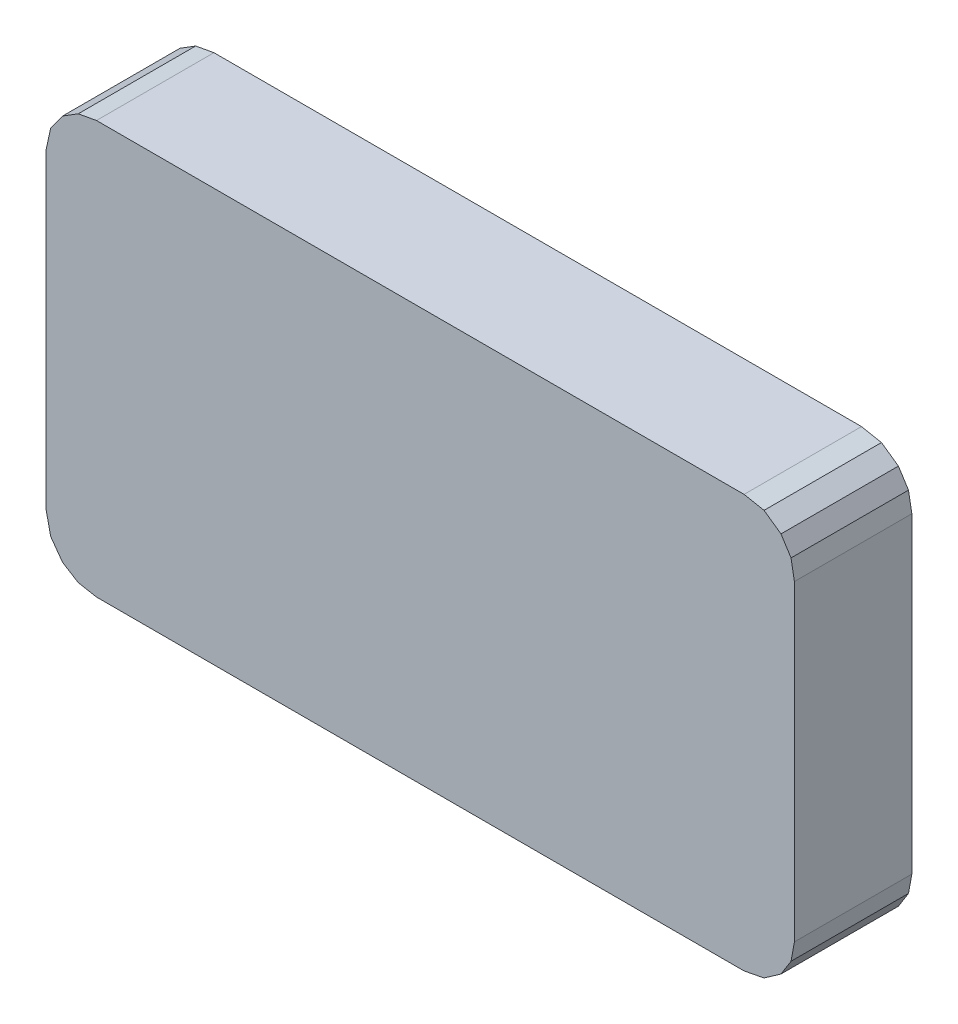
ISO-10303-21;
HEADER;
FILE_DESCRIPTION(('STEP AP214'),'2;1');
FILE_NAME('part.step','',(''),(''),'','','');
FILE_SCHEMA(('AUTOMOTIVE_DESIGN { 1 0 10303 214 1 1 1 1 }'));
ENDSEC;
DATA;
#1=APPLICATION_CONTEXT('core data for automotive mechanical design processes');
#2=APPLICATION_PROTOCOL_DEFINITION('international standard','automotive_design',2000,#1);
#3=PRODUCT_CONTEXT('',#1,'mechanical');
#4=PRODUCT('Part','Part','',(#3));
#5=PRODUCT_RELATED_PRODUCT_CATEGORY('part','',(#4));
#6=PRODUCT_DEFINITION_FORMATION('','',#4);
#7=PRODUCT_DEFINITION_CONTEXT('part definition',#1,'design');
#8=PRODUCT_DEFINITION('design','',#6,#7);
#9=PRODUCT_DEFINITION_SHAPE('','',#8);
#10=(LENGTH_UNIT() NAMED_UNIT(*) SI_UNIT(.MILLI.,.METRE.));
#11=(NAMED_UNIT(*) PLANE_ANGLE_UNIT() SI_UNIT($,.RADIAN.));
#12=(NAMED_UNIT(*) SI_UNIT($,.STERADIAN.) SOLID_ANGLE_UNIT());
#13=UNCERTAINTY_MEASURE_WITH_UNIT(LENGTH_MEASURE(1.E-05),#10,'distance_accuracy_value','');
#14=(GEOMETRIC_REPRESENTATION_CONTEXT(3) GLOBAL_UNCERTAINTY_ASSIGNED_CONTEXT((#13)) GLOBAL_UNIT_ASSIGNED_CONTEXT((#10,
#11,#12)) REPRESENTATION_CONTEXT('',''));
#15=CARTESIAN_POINT('',(0.,0.,0.));
#16=DIRECTION('',(0.,0.,1.));
#17=DIRECTION('',(1.,0.,0.));
#18=AXIS2_PLACEMENT_3D('',#15,#16,#17);
#19=CARTESIAN_POINT('',(12.500505360678,7.00002739885,1.000000526072));
#20=DIRECTION('',(0.,0.,-1.));
#21=DIRECTION('',(-1.,0.,0.));
#22=AXIS2_PLACEMENT_3D('',#19,#20,#21);
#23=PLANE('',#22);
#24=DIRECTION('',(0.538033386964818,-0.842923528270012,0.));
#25=VECTOR('',#24,1.);
#26=CARTESIAN_POINT('',(14.64999758,8.135999071816,1.000000526072));
#27=LINE('',#26,#25);
#28=CARTESIAN_POINT('',(14.64999758,8.135999071816,1.000000526072));
#29=VERTEX_POINT('',#28);
#30=CARTESIAN_POINT('',(14.70999746,8.041998751816,1.000000526072));
#31=VERTEX_POINT('',#30);
#32=EDGE_CURVE('E172',#29,#31,#27,.T.);
#33=ORIENTED_EDGE('',*,*,#32,.F.);
#34=DIRECTION('',(0.818081035233929,-0.57510296451208,0.));
#35=VECTOR('',#34,1.);
#36=CARTESIAN_POINT('',(14.54899956,8.206999691816,1.000000526072));
#37=LINE('',#36,#35);
#38=CARTESIAN_POINT('',(14.54899956,8.20699969181601,1.000000526072));
#39=VERTEX_POINT('',#38);
#40=EDGE_CURVE('E151',#39,#29,#37,.T.);
#41=ORIENTED_EDGE('',*,*,#40,.F.);
#42=DIRECTION('',(0.981857978872436,-0.189617798016262,0.));
#43=VECTOR('',#42,1.);
#44=CARTESIAN_POINT('',(14.43002342,8.229976531816,1.000000526072));
#45=LINE('',#44,#43);
#46=CARTESIAN_POINT('',(14.43002342,8.229976531816,1.000000526072));
#47=VERTEX_POINT('',#46);
#48=EDGE_CURVE('E20',#47,#39,#45,.T.);
#49=ORIENTED_EDGE('',*,*,#48,.F.);
#50=DIRECTION('',(1.,0.,0.));
#51=VECTOR('',#50,1.);
#52=CARTESIAN_POINT('',(10.57002098,8.229976531816,1.000000526072));
#53=LINE('',#52,#51);
#54=CARTESIAN_POINT('',(10.57002098,8.22997653181601,1.000000526072));
#55=VERTEX_POINT('',#54);
#56=EDGE_CURVE('E252',#55,#47,#53,.T.);
#57=ORIENTED_EDGE('',*,*,#56,.F.);
#58=DIRECTION('',(-0.983622947770769,-0.180238443786958,0.));
#59=VECTOR('',#58,1.);
#60=CARTESIAN_POINT('',(10.4609991,8.209999431816,1.000000526072));
#61=LINE('',#60,#59);
#62=CARTESIAN_POINT('',(10.4609991,8.20999943181599,1.000000526072));
#63=VERTEX_POINT('',#62);
#64=EDGE_CURVE('E247',#63,#55,#61,.F.);
#65=ORIENTED_EDGE('',*,*,#64,.F.);
#66=DIRECTION('',(-0.848505667475352,-0.52918629258722,0.));
#67=VECTOR('',#66,1.);
#68=CARTESIAN_POINT('',(10.36799954,8.151998531816,1.000000526072));
#69=LINE('',#68,#67);
#70=CARTESIAN_POINT('',(10.36799954,8.15199853181601,1.000000526072));
#71=VERTEX_POINT('',#70);
#72=EDGE_CURVE('E242',#71,#63,#69,.F.);
#73=ORIENTED_EDGE('',*,*,#72,.F.);
#74=DIRECTION('',(-0.59064525537376,-0.806931336796673,0.));
#75=VECTOR('',#74,1.);
#76=CARTESIAN_POINT('',(10.29699892,8.054998471816,1.000000526072));
#77=LINE('',#76,#75);
#78=CARTESIAN_POINT('',(10.29699892,8.054998471816,1.000000526072));
#79=VERTEX_POINT('',#78);
#80=EDGE_CURVE('E237',#79,#71,#77,.F.);
#81=ORIENTED_EDGE('',*,*,#80,.F.);
#82=DIRECTION('',(-0.211134831832987,-0.977456946768939,0.));
#83=VECTOR('',#82,1.);
#84=CARTESIAN_POINT('',(10.26999872,7.929999991816,1.000000526072));
#85=LINE('',#84,#83);
#86=CARTESIAN_POINT('',(10.26999872,7.929999991816,1.000000526072));
#87=VERTEX_POINT('',#86);
#88=EDGE_CURVE('E232',#87,#79,#85,.F.);
#89=ORIENTED_EDGE('',*,*,#88,.F.);
#90=DIRECTION('',(0.,1.,0.));
#91=VECTOR('',#90,1.);
#92=CARTESIAN_POINT('',(10.26999872,6.069998631816,1.000000526072));
#93=LINE('',#92,#91);
#94=CARTESIAN_POINT('',(10.26999872,6.069998631816,1.000000526072));
#95=VERTEX_POINT('',#94);
#96=EDGE_CURVE('E227',#95,#87,#93,.T.);
#97=ORIENTED_EDGE('',*,*,#96,.F.);
#98=DIRECTION('',(0.212757854209079,-0.977104956221361,0.));
#99=VECTOR('',#98,1.);
#100=CARTESIAN_POINT('',(10.29699892,5.945998371816,1.000000526072));
#101=LINE('',#100,#99);
#102=CARTESIAN_POINT('',(10.29699892,5.94599837181598,1.000000526072));
#103=VERTEX_POINT('',#102);
#104=EDGE_CURVE('E222',#103,#95,#101,.F.);
#105=ORIENTED_EDGE('',*,*,#104,.F.);
#106=DIRECTION('',(0.586706833159886,-0.809799414622842,0.));
#107=VECTOR('',#106,1.);
#108=CARTESIAN_POINT('',(10.36799954,5.848000091816,1.000000526072));
#109=LINE('',#108,#107);
#110=CARTESIAN_POINT('',(10.36799954,5.84800009181599,1.000000526072));
#111=VERTEX_POINT('',#110);
#112=EDGE_CURVE('E217',#111,#103,#109,.F.);
#113=ORIENTED_EDGE('',*,*,#112,.F.);
#114=DIRECTION('',(0.848505667475352,-0.52918629258722,0.));
#115=VECTOR('',#114,1.);
#116=CARTESIAN_POINT('',(10.4609991,5.789999191816,1.000000526072));
#117=LINE('',#116,#115);
#118=CARTESIAN_POINT('',(10.4609991,5.78999919181601,1.000000526072));
#119=VERTEX_POINT('',#118);
#120=EDGE_CURVE('E212',#119,#111,#117,.F.);
#121=ORIENTED_EDGE('',*,*,#120,.F.);
#122=DIRECTION('',(0.983549741971551,-0.180637496294917,0.));
#123=VECTOR('',#122,1.);
#124=CARTESIAN_POINT('',(10.57002098,5.769976371816,1.000000526072));
#125=LINE('',#124,#123);
#126=CARTESIAN_POINT('',(10.57002098,5.76997637181599,1.000000526072));
#127=VERTEX_POINT('',#126);
#128=EDGE_CURVE('E207',#127,#119,#125,.F.);
#129=ORIENTED_EDGE('',*,*,#128,.F.);
#130=DIRECTION('',(0.999999999982463,5.92227605307774E-06,0.));
#131=VECTOR('',#130,1.);
#132=CARTESIAN_POINT('',(14.43002342,5.769999231816,1.000000526072));
#133=LINE('',#132,#131);
#134=CARTESIAN_POINT('',(14.43002342,5.76999923181603,1.000000526072));
#135=VERTEX_POINT('',#134);
#136=EDGE_CURVE('E202',#135,#127,#133,.F.);
#137=ORIENTED_EDGE('',*,*,#136,.F.);
#138=DIRECTION('',(0.98182284019013,0.189799658801025,0.));
#139=VECTOR('',#138,1.);
#140=CARTESIAN_POINT('',(14.54899956,5.792998931816,1.000000526072));
#141=LINE('',#140,#139);
#142=CARTESIAN_POINT('',(14.54899956,5.79299893181601,1.000000526072));
#143=VERTEX_POINT('',#142);
#144=EDGE_CURVE('E197',#143,#135,#141,.F.);
#145=ORIENTED_EDGE('',*,*,#144,.F.);
#146=DIRECTION('',(0.81808103523399,0.575102964511993,0.));
#147=VECTOR('',#146,1.);
#148=CARTESIAN_POINT('',(14.64999758,5.863999551816,1.000000526072));
#149=LINE('',#148,#147);
#150=CARTESIAN_POINT('',(14.64999758,5.86399955181602,1.000000526072));
#151=VERTEX_POINT('',#150);
#152=EDGE_CURVE('E192',#151,#143,#149,.F.);
#153=ORIENTED_EDGE('',*,*,#152,.F.);
#154=DIRECTION('',(0.530000956788827,0.847997043510723,0.));
#155=VECTOR('',#154,1.);
#156=CARTESIAN_POINT('',(14.70999746,5.959998851816,1.000000526072));
#157=LINE('',#156,#155);
#158=CARTESIAN_POINT('',(14.70999746,5.959998851816,1.000000526072));
#159=VERTEX_POINT('',#158);
#160=EDGE_CURVE('E187',#159,#151,#157,.F.);
#161=ORIENTED_EDGE('',*,*,#160,.F.);
#162=DIRECTION('',(0.178907429570017,0.983865911415092,0.));
#163=VECTOR('',#162,1.);
#164=CARTESIAN_POINT('',(14.72999996,6.069998631816,1.000000526072));
#165=LINE('',#164,#163);
#166=CARTESIAN_POINT('',(14.72999996,6.069998631816,1.000000526072));
#167=VERTEX_POINT('',#166);
#168=EDGE_CURVE('E182',#167,#159,#165,.F.);
#169=ORIENTED_EDGE('',*,*,#168,.F.);
#170=DIRECTION('',(0.,1.,0.));
#171=VECTOR('',#170,1.);
#172=CARTESIAN_POINT('',(14.72999996,7.929999991816,1.000000526072));
#173=LINE('',#172,#171);
#174=CARTESIAN_POINT('',(14.72999996,7.92999999181601,1.000000526072));
#175=VERTEX_POINT('',#174);
#176=EDGE_CURVE('E177',#175,#167,#173,.F.);
#177=ORIENTED_EDGE('',*,*,#176,.F.);
#178=DIRECTION('',(0.175813819490637,-0.984423435761316,0.));
#179=VECTOR('',#178,1.);
#180=CARTESIAN_POINT('',(14.70999746,8.041998751816,1.000000526072));
#181=LINE('',#180,#179);
#182=EDGE_CURVE('E173',#31,#175,#181,.T.);
#183=ORIENTED_EDGE('',*,*,#182,.F.);
#184=EDGE_LOOP('',(#33,#41,#49,#57,#65,#73,#81,#89,#97,#105,#113,#121,#129,#137,#145,#153,#161,
#169,#177,#183));
#185=FACE_BOUND('',#184,.T.);
#186=ADVANCED_FACE('F17',(#185),#23,.F.);
#187=CARTESIAN_POINT('',(14.72999996,7.929999991816,0.299999386072));
#188=DIRECTION('',(1.,0.,0.));
#189=DIRECTION('',(0.,0.,-1.));
#190=AXIS2_PLACEMENT_3D('',#187,#188,#189);
#191=PLANE('',#190);
#192=DIRECTION('',(0.,0.,1.));
#193=VECTOR('',#192,1.);
#194=CARTESIAN_POINT('',(14.72999996,6.069998631816,0.299999386072));
#195=LINE('',#194,#193);
#196=CARTESIAN_POINT('',(14.72999996,6.069998631816,0.299999386072));
#197=VERTEX_POINT('',#196);
#198=EDGE_CURVE('E179',#197,#167,#195,.T.);
#199=ORIENTED_EDGE('',*,*,#198,.F.);
#200=DIRECTION('',(0.,1.,0.));
#201=VECTOR('',#200,1.);
#202=CARTESIAN_POINT('',(14.72999996,7.00002739885,0.299999386072));
#203=LINE('',#202,#201);
#204=CARTESIAN_POINT('',(14.72999996,7.929999991816,0.299999386072));
#205=VERTEX_POINT('',#204);
#206=EDGE_CURVE('E260',#205,#197,#203,.F.);
#207=ORIENTED_EDGE('',*,*,#206,.F.);
#208=DIRECTION('',(0.,0.,1.));
#209=VECTOR('',#208,1.);
#210=CARTESIAN_POINT('',(14.72999996,7.92999999181601,0.299999386072));
#211=LINE('',#210,#209);
#212=EDGE_CURVE('E257',#175,#205,#211,.F.);
#213=ORIENTED_EDGE('',*,*,#212,.F.);
#214=ORIENTED_EDGE('',*,*,#176,.T.);
#215=EDGE_LOOP('',(#199,#207,#213,#214));
#216=FACE_BOUND('',#215,.T.);
#217=ADVANCED_FACE('F322',(#216),#191,.T.);
#218=CARTESIAN_POINT('',(14.72999996,6.069998631816,0.299999386072));
#219=DIRECTION('',(0.983865911415092,-0.178907429570017,0.));
#220=DIRECTION('',(0.178907429570017,0.983865911415092,0.));
#221=AXIS2_PLACEMENT_3D('',#218,#219,#220);
#222=PLANE('',#221);
#223=DIRECTION('',(0.,0.,1.));
#224=VECTOR('',#223,1.);
#225=CARTESIAN_POINT('',(14.70999746,5.959998851816,0.299999386072));
#226=LINE('',#225,#224);
#227=CARTESIAN_POINT('',(14.70999746,5.959998851816,0.299999386072));
#228=VERTEX_POINT('',#227);
#229=EDGE_CURVE('E184',#228,#159,#226,.T.);
#230=ORIENTED_EDGE('',*,*,#229,.F.);
#231=DIRECTION('',(-0.178907429570127,-0.983865911415072,0.));
#232=VECTOR('',#231,1.);
#233=CARTESIAN_POINT('',(14.72999996,6.069998631816,0.299999386072));
#234=LINE('',#233,#232);
#235=EDGE_CURVE('E263',#197,#228,#234,.T.);
#236=ORIENTED_EDGE('',*,*,#235,.F.);
#237=ORIENTED_EDGE('',*,*,#198,.T.);
#238=ORIENTED_EDGE('',*,*,#168,.T.);
#239=EDGE_LOOP('',(#230,#236,#237,#238));
#240=FACE_BOUND('',#239,.T.);
#241=ADVANCED_FACE('F326',(#240),#222,.T.);
#242=CARTESIAN_POINT('',(14.70999746,5.959998851816,0.299999386072));
#243=DIRECTION('',(0.847997043510723,-0.530000956788827,0.));
#244=DIRECTION('',(0.530000956788827,0.847997043510723,0.));
#245=AXIS2_PLACEMENT_3D('',#242,#243,#244);
#246=PLANE('',#245);
#247=DIRECTION('',(0.,0.,1.));
#248=VECTOR('',#247,1.);
#249=CARTESIAN_POINT('',(14.64999758,5.863999551816,0.299999386072));
#250=LINE('',#249,#248);
#251=CARTESIAN_POINT('',(14.64999758,5.86399955181602,0.299999386072));
#252=VERTEX_POINT('',#251);
#253=EDGE_CURVE('E189',#252,#151,#250,.T.);
#254=ORIENTED_EDGE('',*,*,#253,.F.);
#255=DIRECTION('',(-0.530000956788381,-0.847997043511003,0.));
#256=VECTOR('',#255,1.);
#257=CARTESIAN_POINT('',(14.70999746,5.959998851816,0.299999386072));
#258=LINE('',#257,#256);
#259=EDGE_CURVE('E266',#228,#252,#258,.T.);
#260=ORIENTED_EDGE('',*,*,#259,.F.);
#261=ORIENTED_EDGE('',*,*,#229,.T.);
#262=ORIENTED_EDGE('',*,*,#160,.T.);
#263=EDGE_LOOP('',(#254,#260,#261,#262));
#264=FACE_BOUND('',#263,.T.);
#265=ADVANCED_FACE('F328',(#264),#246,.T.);
#266=CARTESIAN_POINT('',(14.64999758,5.863999551816,0.299999386072));
#267=DIRECTION('',(0.575102964511993,-0.81808103523399,0.));
#268=DIRECTION('',(0.81808103523399,0.575102964511993,0.));
#269=AXIS2_PLACEMENT_3D('',#266,#267,#268);
#270=PLANE('',#269);
#271=DIRECTION('',(0.,0.,1.));
#272=VECTOR('',#271,1.);
#273=CARTESIAN_POINT('',(14.54899956,5.792998931816,0.299999386072));
#274=LINE('',#273,#272);
#275=CARTESIAN_POINT('',(14.54899956,5.79299893181601,0.299999386072));
#276=VERTEX_POINT('',#275);
#277=EDGE_CURVE('E194',#276,#143,#274,.T.);
#278=ORIENTED_EDGE('',*,*,#277,.F.);
#279=DIRECTION('',(-0.818081035233926,-0.575102964512085,0.));
#280=VECTOR('',#279,1.);
#281=CARTESIAN_POINT('',(14.64999758,5.863999551816,0.299999386072));
#282=LINE('',#281,#280);
#283=EDGE_CURVE('E269',#252,#276,#282,.T.);
#284=ORIENTED_EDGE('',*,*,#283,.F.);
#285=ORIENTED_EDGE('',*,*,#253,.T.);
#286=ORIENTED_EDGE('',*,*,#152,.T.);
#287=EDGE_LOOP('',(#278,#284,#285,#286));
#288=FACE_BOUND('',#287,.T.);
#289=ADVANCED_FACE('F332',(#288),#270,.T.);
#290=CARTESIAN_POINT('',(14.54899956,5.792998931816,0.299999386072));
#291=DIRECTION('',(0.189799658801025,-0.98182284019013,0.));
#292=DIRECTION('',(0.98182284019013,0.189799658801025,0.));
#293=AXIS2_PLACEMENT_3D('',#290,#291,#292);
#294=PLANE('',#293);
#295=DIRECTION('',(0.,0.,1.));
#296=VECTOR('',#295,1.);
#297=CARTESIAN_POINT('',(14.43002342,5.769999231816,0.299999386072));
#298=LINE('',#297,#296);
#299=CARTESIAN_POINT('',(14.43002342,5.76999923181603,0.299999386072));
#300=VERTEX_POINT('',#299);
#301=EDGE_CURVE('E199',#300,#135,#298,.T.);
#302=ORIENTED_EDGE('',*,*,#301,.F.);
#303=DIRECTION('',(-0.98182284019004,-0.189799658801492,0.));
#304=VECTOR('',#303,1.);
#305=CARTESIAN_POINT('',(14.54899956,5.792998931816,0.299999386072));
#306=LINE('',#305,#304);
#307=EDGE_CURVE('E272',#276,#300,#306,.T.);
#308=ORIENTED_EDGE('',*,*,#307,.F.);
#309=ORIENTED_EDGE('',*,*,#277,.T.);
#310=ORIENTED_EDGE('',*,*,#144,.T.);
#311=EDGE_LOOP('',(#302,#308,#309,#310));
#312=FACE_BOUND('',#311,.T.);
#313=ADVANCED_FACE('F336',(#312),#294,.T.);
#314=CARTESIAN_POINT('',(14.43002342,5.769999231816,0.299999386072));
#315=DIRECTION('',(5.92227605307774E-06,-0.999999999982463,0.));
#316=DIRECTION('',(0.999999999982463,5.92227605307774E-06,0.));
#317=AXIS2_PLACEMENT_3D('',#314,#315,#316);
#318=PLANE('',#317);
#319=DIRECTION('',(0.,0.,1.));
#320=VECTOR('',#319,1.);
#321=CARTESIAN_POINT('',(10.57002098,5.769976371816,0.299999386072));
#322=LINE('',#321,#320);
#323=CARTESIAN_POINT('',(10.57002098,5.76997637181599,0.299999386072));
#324=VERTEX_POINT('',#323);
#325=EDGE_CURVE('E204',#324,#127,#322,.T.);
#326=ORIENTED_EDGE('',*,*,#325,.F.);
#327=DIRECTION('',(-0.999999999982463,-5.92227604895712E-06,0.));
#328=VECTOR('',#327,1.);
#329=CARTESIAN_POINT('',(14.43002342,5.769999231816,0.299999386072));
#330=LINE('',#329,#328);
#331=EDGE_CURVE('E275',#300,#324,#330,.T.);
#332=ORIENTED_EDGE('',*,*,#331,.F.);
#333=ORIENTED_EDGE('',*,*,#301,.T.);
#334=ORIENTED_EDGE('',*,*,#136,.T.);
#335=EDGE_LOOP('',(#326,#332,#333,#334));
#336=FACE_BOUND('',#335,.T.);
#337=ADVANCED_FACE('F340',(#336),#318,.T.);
#338=CARTESIAN_POINT('',(10.57002098,5.769976371816,0.299999386072));
#339=DIRECTION('',(-0.180637496294917,-0.983549741971551,0.));
#340=DIRECTION('',(0.983549741971551,-0.180637496294917,0.));
#341=AXIS2_PLACEMENT_3D('',#338,#339,#340);
#342=PLANE('',#341);
#343=DIRECTION('',(0.,0.,1.));
#344=VECTOR('',#343,1.);
#345=CARTESIAN_POINT('',(10.4609991,5.789999191816,0.299999386072));
#346=LINE('',#345,#344);
#347=CARTESIAN_POINT('',(10.4609991,5.78999919181601,0.299999386072));
#348=VERTEX_POINT('',#347);
#349=EDGE_CURVE('E209',#348,#119,#346,.T.);
#350=ORIENTED_EDGE('',*,*,#349,.F.);
#351=DIRECTION('',(-0.983549741971587,0.180637496294719,0.));
#352=VECTOR('',#351,1.);
#353=CARTESIAN_POINT('',(10.57002098,5.769976371816,0.299999386072));
#354=LINE('',#353,#352);
#355=EDGE_CURVE('E278',#324,#348,#354,.T.);
#356=ORIENTED_EDGE('',*,*,#355,.F.);
#357=ORIENTED_EDGE('',*,*,#325,.T.);
#358=ORIENTED_EDGE('',*,*,#128,.T.);
#359=EDGE_LOOP('',(#350,#356,#357,#358));
#360=FACE_BOUND('',#359,.T.);
#361=ADVANCED_FACE('F344',(#360),#342,.T.);
#362=CARTESIAN_POINT('',(10.4609991,5.789999191816,0.299999386072));
#363=DIRECTION('',(-0.52918629258722,-0.848505667475352,0.));
#364=DIRECTION('',(0.848505667475352,-0.52918629258722,0.));
#365=AXIS2_PLACEMENT_3D('',#362,#363,#364);
#366=PLANE('',#365);
#367=DIRECTION('',(0.,0.,1.));
#368=VECTOR('',#367,1.);
#369=CARTESIAN_POINT('',(10.36799954,5.848000091816,0.299999386072));
#370=LINE('',#369,#368);
#371=CARTESIAN_POINT('',(10.36799954,5.84800009181599,0.299999386072));
#372=VERTEX_POINT('',#371);
#373=EDGE_CURVE('E214',#372,#111,#370,.T.);
#374=ORIENTED_EDGE('',*,*,#373,.F.);
#375=DIRECTION('',(-0.848505667475214,0.529186292587441,0.));
#376=VECTOR('',#375,1.);
#377=CARTESIAN_POINT('',(10.4609991,5.789999191816,0.299999386072));
#378=LINE('',#377,#376);
#379=EDGE_CURVE('E281',#348,#372,#378,.T.);
#380=ORIENTED_EDGE('',*,*,#379,.F.);
#381=ORIENTED_EDGE('',*,*,#349,.T.);
#382=ORIENTED_EDGE('',*,*,#120,.T.);
#383=EDGE_LOOP('',(#374,#380,#381,#382));
#384=FACE_BOUND('',#383,.T.);
#385=ADVANCED_FACE('F348',(#384),#366,.T.);
#386=CARTESIAN_POINT('',(10.36799954,5.848000091816,0.299999386072));
#387=DIRECTION('',(-0.809799414622842,-0.586706833159886,0.));
#388=DIRECTION('',(0.586706833159886,-0.809799414622842,0.));
#389=AXIS2_PLACEMENT_3D('',#386,#387,#388);
#390=PLANE('',#389);
#391=DIRECTION('',(0.,0.,1.));
#392=VECTOR('',#391,1.);
#393=CARTESIAN_POINT('',(10.29699892,5.945998371816,0.299999386072));
#394=LINE('',#393,#392);
#395=CARTESIAN_POINT('',(10.29699892,5.94599837181598,0.299999386072));
#396=VERTEX_POINT('',#395);
#397=EDGE_CURVE('E219',#396,#103,#394,.T.);
#398=ORIENTED_EDGE('',*,*,#397,.F.);
#399=DIRECTION('',(-0.58670683315951,0.809799414623115,0.));
#400=VECTOR('',#399,1.);
#401=CARTESIAN_POINT('',(10.36799954,5.848000091816,0.299999386072));
#402=LINE('',#401,#400);
#403=EDGE_CURVE('E284',#372,#396,#402,.T.);
#404=ORIENTED_EDGE('',*,*,#403,.F.);
#405=ORIENTED_EDGE('',*,*,#373,.T.);
#406=ORIENTED_EDGE('',*,*,#112,.T.);
#407=EDGE_LOOP('',(#398,#404,#405,#406));
#408=FACE_BOUND('',#407,.T.);
#409=ADVANCED_FACE('F352',(#408),#390,.T.);
#410=CARTESIAN_POINT('',(10.29699892,5.945998371816,0.299999386072));
#411=DIRECTION('',(-0.977104956221361,-0.212757854209079,0.));
#412=DIRECTION('',(0.212757854209079,-0.977104956221361,0.));
#413=AXIS2_PLACEMENT_3D('',#410,#411,#412);
#414=PLANE('',#413);
#415=DIRECTION('',(0.,0.,1.));
#416=VECTOR('',#415,1.);
#417=CARTESIAN_POINT('',(10.26999872,6.069998631816,0.299999386072));
#418=LINE('',#417,#416);
#419=CARTESIAN_POINT('',(10.26999872,6.069998631816,0.299999386072));
#420=VERTEX_POINT('',#419);
#421=EDGE_CURVE('E224',#420,#95,#418,.T.);
#422=ORIENTED_EDGE('',*,*,#421,.F.);
#423=DIRECTION('',(-0.212757854209067,0.977104956221364,0.));
#424=VECTOR('',#423,1.);
#425=CARTESIAN_POINT('',(10.29699892,5.945998371816,0.299999386072));
#426=LINE('',#425,#424);
#427=EDGE_CURVE('E287',#396,#420,#426,.T.);
#428=ORIENTED_EDGE('',*,*,#427,.F.);
#429=ORIENTED_EDGE('',*,*,#397,.T.);
#430=ORIENTED_EDGE('',*,*,#104,.T.);
#431=EDGE_LOOP('',(#422,#428,#429,#430));
#432=FACE_BOUND('',#431,.T.);
#433=ADVANCED_FACE('F356',(#432),#414,.T.);
#434=CARTESIAN_POINT('',(10.26999872,6.069998631816,0.299999386072));
#435=DIRECTION('',(-1.,0.,0.));
#436=DIRECTION('',(0.,0.,1.));
#437=AXIS2_PLACEMENT_3D('',#434,#435,#436);
#438=PLANE('',#437);
#439=DIRECTION('',(0.,0.,1.));
#440=VECTOR('',#439,1.);
#441=CARTESIAN_POINT('',(10.26999872,7.929999991816,0.299999386072));
#442=LINE('',#441,#440);
#443=CARTESIAN_POINT('',(10.26999872,7.929999991816,0.299999386072));
#444=VERTEX_POINT('',#443);
#445=EDGE_CURVE('E229',#444,#87,#442,.T.);
#446=ORIENTED_EDGE('',*,*,#445,.F.);
#447=DIRECTION('',(0.,1.,0.));
#448=VECTOR('',#447,1.);
#449=CARTESIAN_POINT('',(10.26999872,7.00002739885,0.299999386072));
#450=LINE('',#449,#448);
#451=EDGE_CURVE('E290',#420,#444,#450,.T.);
#452=ORIENTED_EDGE('',*,*,#451,.F.);
#453=ORIENTED_EDGE('',*,*,#421,.T.);
#454=ORIENTED_EDGE('',*,*,#96,.T.);
#455=EDGE_LOOP('',(#446,#452,#453,#454));
#456=FACE_BOUND('',#455,.T.);
#457=ADVANCED_FACE('F360',(#456),#438,.T.);
#458=CARTESIAN_POINT('',(10.26999872,7.929999991816,0.299999386072));
#459=DIRECTION('',(-0.977456946768939,0.211134831832987,0.));
#460=DIRECTION('',(-0.211134831832987,-0.977456946768939,0.));
#461=AXIS2_PLACEMENT_3D('',#458,#459,#460);
#462=PLANE('',#461);
#463=DIRECTION('',(0.,0.,1.));
#464=VECTOR('',#463,1.);
#465=CARTESIAN_POINT('',(10.29699892,8.054998471816,0.299999386072));
#466=LINE('',#465,#464);
#467=CARTESIAN_POINT('',(10.29699892,8.054998471816,0.299999386072));
#468=VERTEX_POINT('',#467);
#469=EDGE_CURVE('E234',#468,#79,#466,.T.);
#470=ORIENTED_EDGE('',*,*,#469,.F.);
#471=DIRECTION('',(0.211134831832758,0.977456946768989,0.));
#472=VECTOR('',#471,1.);
#473=CARTESIAN_POINT('',(10.26999872,7.929999991816,0.299999386072));
#474=LINE('',#473,#472);
#475=EDGE_CURVE('E293',#444,#468,#474,.T.);
#476=ORIENTED_EDGE('',*,*,#475,.F.);
#477=ORIENTED_EDGE('',*,*,#445,.T.);
#478=ORIENTED_EDGE('',*,*,#88,.T.);
#479=EDGE_LOOP('',(#470,#476,#477,#478));
#480=FACE_BOUND('',#479,.T.);
#481=ADVANCED_FACE('F364',(#480),#462,.T.);
#482=CARTESIAN_POINT('',(10.29699892,8.054998471816,0.299999386072));
#483=DIRECTION('',(-0.806931336796673,0.59064525537376,0.));
#484=DIRECTION('',(-0.59064525537376,-0.806931336796673,0.));
#485=AXIS2_PLACEMENT_3D('',#482,#483,#484);
#486=PLANE('',#485);
#487=DIRECTION('',(0.,0.,1.));
#488=VECTOR('',#487,1.);
#489=CARTESIAN_POINT('',(10.36799954,8.151998531816,0.299999386072));
#490=LINE('',#489,#488);
#491=CARTESIAN_POINT('',(10.36799954,8.15199853181601,0.299999386072));
#492=VERTEX_POINT('',#491);
#493=EDGE_CURVE('E239',#492,#71,#490,.T.);
#494=ORIENTED_EDGE('',*,*,#493,.F.);
#495=DIRECTION('',(0.590645255373918,0.806931336796558,0.));
#496=VECTOR('',#495,1.);
#497=CARTESIAN_POINT('',(10.29699892,8.054998471816,0.299999386072));
#498=LINE('',#497,#496);
#499=EDGE_CURVE('E296',#468,#492,#498,.T.);
#500=ORIENTED_EDGE('',*,*,#499,.F.);
#501=ORIENTED_EDGE('',*,*,#469,.T.);
#502=ORIENTED_EDGE('',*,*,#80,.T.);
#503=EDGE_LOOP('',(#494,#500,#501,#502));
#504=FACE_BOUND('',#503,.T.);
#505=ADVANCED_FACE('F368',(#504),#486,.T.);
#506=CARTESIAN_POINT('',(10.36799954,8.151998531816,0.299999386072));
#507=DIRECTION('',(-0.52918629258722,0.848505667475352,0.));
#508=DIRECTION('',(-0.848505667475352,-0.52918629258722,0.));
#509=AXIS2_PLACEMENT_3D('',#506,#507,#508);
#510=PLANE('',#509);
#511=DIRECTION('',(0.,0.,1.));
#512=VECTOR('',#511,1.);
#513=CARTESIAN_POINT('',(10.4609991,8.209999431816,0.299999386072));
#514=LINE('',#513,#512);
#515=CARTESIAN_POINT('',(10.4609991,8.20999943181599,0.299999386072));
#516=VERTEX_POINT('',#515);
#517=EDGE_CURVE('E244',#516,#63,#514,.T.);
#518=ORIENTED_EDGE('',*,*,#517,.F.);
#519=DIRECTION('',(0.848505667475211,0.529186292587447,0.));
#520=VECTOR('',#519,1.);
#521=CARTESIAN_POINT('',(10.36799954,8.151998531816,0.299999386072));
#522=LINE('',#521,#520);
#523=EDGE_CURVE('E299',#492,#516,#522,.T.);
#524=ORIENTED_EDGE('',*,*,#523,.F.);
#525=ORIENTED_EDGE('',*,*,#493,.T.);
#526=ORIENTED_EDGE('',*,*,#72,.T.);
#527=EDGE_LOOP('',(#518,#524,#525,#526));
#528=FACE_BOUND('',#527,.T.);
#529=ADVANCED_FACE('F372',(#528),#510,.T.);
#530=CARTESIAN_POINT('',(10.4609991,8.209999431816,0.299999386072));
#531=DIRECTION('',(-0.180238443786958,0.983622947770769,0.));
#532=DIRECTION('',(-0.983622947770769,-0.180238443786958,0.));
#533=AXIS2_PLACEMENT_3D('',#530,#531,#532);
#534=PLANE('',#533);
#535=DIRECTION('',(0.,0.,1.));
#536=VECTOR('',#535,1.);
#537=CARTESIAN_POINT('',(10.57002098,8.229976531816,0.299999386072));
#538=LINE('',#537,#536);
#539=CARTESIAN_POINT('',(10.57002098,8.22997653181601,0.299999386072));
#540=VERTEX_POINT('',#539);
#541=EDGE_CURVE('E249',#540,#55,#538,.T.);
#542=ORIENTED_EDGE('',*,*,#541,.F.);
#543=DIRECTION('',(0.983622947770798,0.180238443786794,0.));
#544=VECTOR('',#543,1.);
#545=CARTESIAN_POINT('',(10.4609991,8.209999431816,0.299999386072));
#546=LINE('',#545,#544);
#547=EDGE_CURVE('E302',#516,#540,#546,.T.);
#548=ORIENTED_EDGE('',*,*,#547,.F.);
#549=ORIENTED_EDGE('',*,*,#517,.T.);
#550=ORIENTED_EDGE('',*,*,#64,.T.);
#551=EDGE_LOOP('',(#542,#548,#549,#550));
#552=FACE_BOUND('',#551,.T.);
#553=ADVANCED_FACE('F376',(#552),#534,.T.);
#554=CARTESIAN_POINT('',(10.57002098,8.229976531816,0.299999386072));
#555=DIRECTION('',(0.,1.,0.));
#556=DIRECTION('',(0.,0.,1.));
#557=AXIS2_PLACEMENT_3D('',#554,#555,#556);
#558=PLANE('',#557);
#559=DIRECTION('',(0.,0.,1.));
#560=VECTOR('',#559,1.);
#561=CARTESIAN_POINT('',(14.43002342,8.229976531816,0.299999386072));
#562=LINE('',#561,#560);
#563=CARTESIAN_POINT('',(14.43002342,8.229976531816,0.299999386072));
#564=VERTEX_POINT('',#563);
#565=EDGE_CURVE('E160',#564,#47,#562,.T.);
#566=ORIENTED_EDGE('',*,*,#565,.F.);
#567=DIRECTION('',(-1.,0.,0.));
#568=VECTOR('',#567,1.);
#569=CARTESIAN_POINT('',(12.500505360678,8.229976531816,0.299999386072));
#570=LINE('',#569,#568);
#571=EDGE_CURVE('E305',#540,#564,#570,.F.);
#572=ORIENTED_EDGE('',*,*,#571,.F.);
#573=ORIENTED_EDGE('',*,*,#541,.T.);
#574=ORIENTED_EDGE('',*,*,#56,.T.);
#575=EDGE_LOOP('',(#566,#572,#573,#574));
#576=FACE_BOUND('',#575,.T.);
#577=ADVANCED_FACE('F379',(#576),#558,.T.);
#578=CARTESIAN_POINT('',(14.43002342,8.229976531816,0.299999386072));
#579=DIRECTION('',(0.18961779801609,0.981857978872469,0.));
#580=DIRECTION('',(-0.981857978872469,0.18961779801609,0.));
#581=AXIS2_PLACEMENT_3D('',#578,#579,#580);
#582=PLANE('',#581);
#583=DIRECTION('',(0.,0.,1.));
#584=VECTOR('',#583,1.);
#585=CARTESIAN_POINT('',(14.54899956,8.206999691816,0.299999386072));
#586=LINE('',#585,#584);
#587=CARTESIAN_POINT('',(14.54899956,8.20699969181601,0.299999386072));
#588=VERTEX_POINT('',#587);
#589=EDGE_CURVE('E158',#588,#39,#586,.T.);
#590=ORIENTED_EDGE('',*,*,#589,.F.);
#591=DIRECTION('',(0.981857978872436,-0.189617798016262,0.));
#592=VECTOR('',#591,1.);
#593=CARTESIAN_POINT('',(14.43002342,8.229976531816,0.299999386072));
#594=LINE('',#593,#592);
#595=EDGE_CURVE('E308',#564,#588,#594,.T.);
#596=ORIENTED_EDGE('',*,*,#595,.F.);
#597=ORIENTED_EDGE('',*,*,#565,.T.);
#598=ORIENTED_EDGE('',*,*,#48,.T.);
#599=EDGE_LOOP('',(#590,#596,#597,#598));
#600=FACE_BOUND('',#599,.T.);
#601=ADVANCED_FACE('F156',(#600),#582,.T.);
#602=CARTESIAN_POINT('',(14.54899956,8.206999691816,0.299999386072));
#603=DIRECTION('',(0.575102964511993,0.81808103523399,0.));
#604=DIRECTION('',(-0.81808103523399,0.575102964511993,0.));
#605=AXIS2_PLACEMENT_3D('',#602,#603,#604);
#606=PLANE('',#605);
#607=DIRECTION('',(0.,0.,1.));
#608=VECTOR('',#607,1.);
#609=CARTESIAN_POINT('',(14.64999758,8.135999071816,0.299999386072));
#610=LINE('',#609,#608);
#611=CARTESIAN_POINT('',(14.64999758,8.13599907181601,0.299999386072));
#612=VERTEX_POINT('',#611);
#613=EDGE_CURVE('E168',#612,#29,#610,.T.);
#614=ORIENTED_EDGE('',*,*,#613,.F.);
#615=DIRECTION('',(0.818081035233929,-0.57510296451208,0.));
#616=VECTOR('',#615,1.);
#617=CARTESIAN_POINT('',(14.54899956,8.206999691816,0.299999386072));
#618=LINE('',#617,#616);
#619=EDGE_CURVE('E166',#588,#612,#618,.T.);
#620=ORIENTED_EDGE('',*,*,#619,.F.);
#621=ORIENTED_EDGE('',*,*,#589,.T.);
#622=ORIENTED_EDGE('',*,*,#40,.T.);
#623=EDGE_LOOP('',(#614,#620,#621,#622));
#624=FACE_BOUND('',#623,.T.);
#625=ADVANCED_FACE('F164',(#624),#606,.T.);
#626=CARTESIAN_POINT('',(14.64999758,8.135999071816,0.299999386072));
#627=DIRECTION('',(0.842923528269926,0.538033386964953,0.));
#628=DIRECTION('',(-0.538033386964953,0.842923528269926,0.));
#629=AXIS2_PLACEMENT_3D('',#626,#627,#628);
#630=PLANE('',#629);
#631=DIRECTION('',(0.,0.,1.));
#632=VECTOR('',#631,1.);
#633=CARTESIAN_POINT('',(14.70999746,8.041998751816,0.299999386072));
#634=LINE('',#633,#632);
#635=CARTESIAN_POINT('',(14.70999746,8.041998751816,0.299999386072));
#636=VERTEX_POINT('',#635);
#637=EDGE_CURVE('E35',#636,#31,#634,.T.);
#638=ORIENTED_EDGE('',*,*,#637,.F.);
#639=DIRECTION('',(0.538033386964818,-0.842923528270012,0.));
#640=VECTOR('',#639,1.);
#641=CARTESIAN_POINT('',(14.64999758,8.135999071816,0.299999386072));
#642=LINE('',#641,#640);
#643=EDGE_CURVE('E26',#612,#636,#642,.T.);
#644=ORIENTED_EDGE('',*,*,#643,.F.);
#645=ORIENTED_EDGE('',*,*,#613,.T.);
#646=ORIENTED_EDGE('',*,*,#32,.T.);
#647=EDGE_LOOP('',(#638,#644,#645,#646));
#648=FACE_BOUND('',#647,.T.);
#649=ADVANCED_FACE('F314',(#648),#630,.T.);
#650=CARTESIAN_POINT('',(14.70999746,8.041998751816,0.299999386072));
#651=DIRECTION('',(0.984423435761243,0.175813819491043,0.));
#652=DIRECTION('',(-0.175813819491043,0.984423435761243,0.));
#653=AXIS2_PLACEMENT_3D('',#650,#651,#652);
#654=PLANE('',#653);
#655=ORIENTED_EDGE('',*,*,#212,.T.);
#656=DIRECTION('',(0.175813819490637,-0.984423435761316,0.));
#657=VECTOR('',#656,1.);
#658=CARTESIAN_POINT('',(14.70999746,8.041998751816,0.299999386072));
#659=LINE('',#658,#657);
#660=EDGE_CURVE('E11',#636,#205,#659,.T.);
#661=ORIENTED_EDGE('',*,*,#660,.F.);
#662=ORIENTED_EDGE('',*,*,#637,.T.);
#663=ORIENTED_EDGE('',*,*,#182,.T.);
#664=EDGE_LOOP('',(#655,#661,#662,#663));
#665=FACE_BOUND('',#664,.T.);
#666=ADVANCED_FACE('F316',(#665),#654,.T.);
#667=CARTESIAN_POINT('',(12.500505360678,7.00002739885,0.299999386072));
#668=DIRECTION('',(0.,0.,-1.));
#669=DIRECTION('',(-1.,0.,0.));
#670=AXIS2_PLACEMENT_3D('',#667,#668,#669);
#671=PLANE('',#670);
#672=ORIENTED_EDGE('',*,*,#643,.T.);
#673=ORIENTED_EDGE('',*,*,#660,.T.);
#674=ORIENTED_EDGE('',*,*,#206,.T.);
#675=ORIENTED_EDGE('',*,*,#235,.T.);
#676=ORIENTED_EDGE('',*,*,#259,.T.);
#677=ORIENTED_EDGE('',*,*,#283,.T.);
#678=ORIENTED_EDGE('',*,*,#307,.T.);
#679=ORIENTED_EDGE('',*,*,#331,.T.);
#680=ORIENTED_EDGE('',*,*,#355,.T.);
#681=ORIENTED_EDGE('',*,*,#379,.T.);
#682=ORIENTED_EDGE('',*,*,#403,.T.);
#683=ORIENTED_EDGE('',*,*,#427,.T.);
#684=ORIENTED_EDGE('',*,*,#451,.T.);
#685=ORIENTED_EDGE('',*,*,#475,.T.);
#686=ORIENTED_EDGE('',*,*,#499,.T.);
#687=ORIENTED_EDGE('',*,*,#523,.T.);
#688=ORIENTED_EDGE('',*,*,#547,.T.);
#689=ORIENTED_EDGE('',*,*,#571,.T.);
#690=ORIENTED_EDGE('',*,*,#595,.T.);
#691=ORIENTED_EDGE('',*,*,#619,.T.);
#692=EDGE_LOOP('',(#672,#673,#674,#675,#676,#677,#678,#679,#680,#681,#682,#683,#684,#685,#686,
#687,#688,#689,#690,#691));
#693=FACE_BOUND('',#692,.T.);
#694=ADVANCED_FACE('F313',(#693),#671,.T.);
#695=CLOSED_SHELL('',(#186,#217,#241,#265,#289,#313,#337,#361,#385,#409,#433,#457,#481,#505,
#529,#553,#577,#601,#625,#649,#666,#694));
#696=MANIFOLD_SOLID_BREP('B1',#695);
#697=ADVANCED_BREP_SHAPE_REPRESENTATION('',(#18,#696),#14);
#698=SHAPE_DEFINITION_REPRESENTATION(#9,#697);
ENDSEC;
END-ISO-10303-21;
